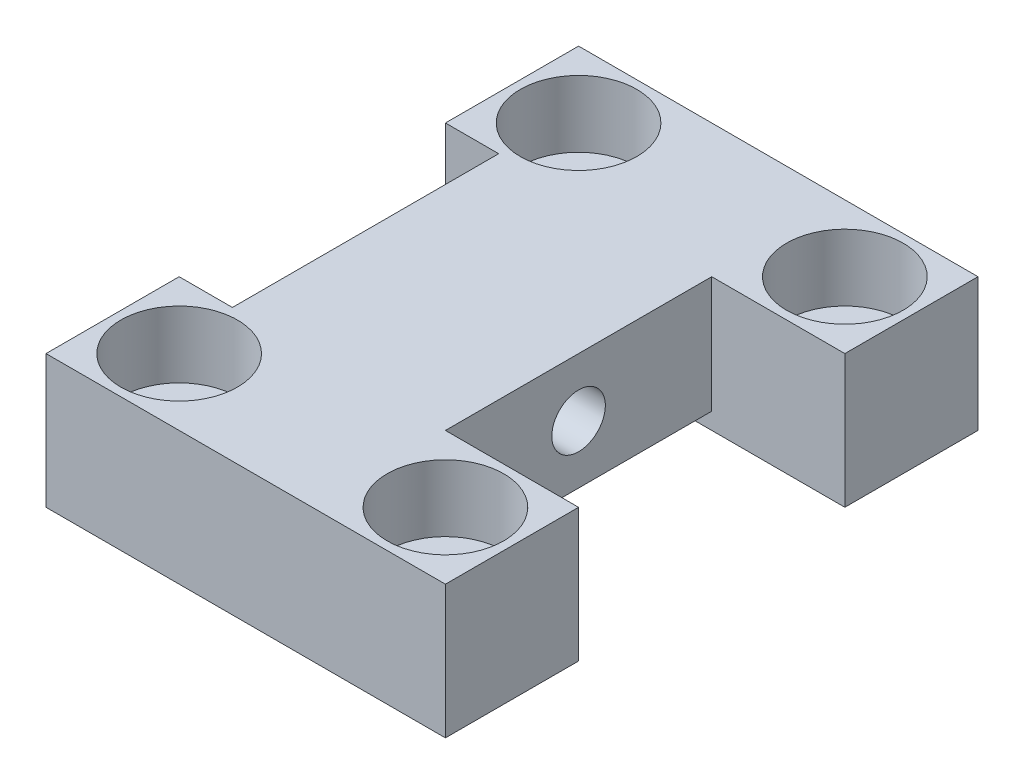
ISO-10303-21;
HEADER;
FILE_DESCRIPTION(('STEP AP214'),'2;1');
FILE_NAME('part.step','',(''),(''),'','','');
FILE_SCHEMA(('AUTOMOTIVE_DESIGN { 1 0 10303 214 1 1 1 1 }'));
ENDSEC;
DATA;
#1=APPLICATION_CONTEXT('core data for automotive mechanical design processes');
#2=APPLICATION_PROTOCOL_DEFINITION('international standard','automotive_design',2000,#1);
#3=PRODUCT_CONTEXT('',#1,'mechanical');
#4=PRODUCT('Part','Part','',(#3));
#5=PRODUCT_RELATED_PRODUCT_CATEGORY('part','',(#4));
#6=PRODUCT_DEFINITION_FORMATION('','',#4);
#7=PRODUCT_DEFINITION_CONTEXT('part definition',#1,'design');
#8=PRODUCT_DEFINITION('design','',#6,#7);
#9=PRODUCT_DEFINITION_SHAPE('','',#8);
#10=(LENGTH_UNIT() NAMED_UNIT(*) SI_UNIT(.MILLI.,.METRE.));
#11=(NAMED_UNIT(*) PLANE_ANGLE_UNIT() SI_UNIT($,.RADIAN.));
#12=(NAMED_UNIT(*) SI_UNIT($,.STERADIAN.) SOLID_ANGLE_UNIT());
#13=UNCERTAINTY_MEASURE_WITH_UNIT(LENGTH_MEASURE(1.E-05),#10,'distance_accuracy_value','');
#14=(GEOMETRIC_REPRESENTATION_CONTEXT(3) GLOBAL_UNCERTAINTY_ASSIGNED_CONTEXT((#13)) GLOBAL_UNIT_ASSIGNED_CONTEXT((#10,
#11,#12)) REPRESENTATION_CONTEXT('',''));
#15=CARTESIAN_POINT('',(0.,0.,0.));
#16=DIRECTION('',(0.,0.,1.));
#17=DIRECTION('',(1.,0.,0.));
#18=AXIS2_PLACEMENT_3D('',#15,#16,#17);
#19=CARTESIAN_POINT('',(-19.05,0.,25.4));
#20=DIRECTION('',(0.,1.,0.));
#21=DIRECTION('',(0.,0.,1.));
#22=AXIS2_PLACEMENT_3D('',#19,#20,#21);
#23=PLANE('',#22);
#24=CARTESIAN_POINT('',(-12.7,0.,19.05));
#25=DIRECTION('',(0.,1.,0.));
#26=DIRECTION('',(0.,0.,1.));
#27=AXIS2_PLACEMENT_3D('',#24,#25,#26);
#28=CIRCLE('',#27,3.3782);
#29=CARTESIAN_POINT('',(-12.7,0.,22.4282));
#30=VERTEX_POINT('',#29);
#31=EDGE_CURVE('E214',#30,#30,#28,.T.);
#32=ORIENTED_EDGE('',*,*,#31,.T.);
#33=EDGE_LOOP('',(#32));
#34=FACE_BOUND('',#33,.T.);
#35=CARTESIAN_POINT('',(12.7,0.,19.05));
#36=DIRECTION('',(0.,1.,0.));
#37=DIRECTION('',(0.,0.,1.));
#38=AXIS2_PLACEMENT_3D('',#35,#36,#37);
#39=CIRCLE('',#38,3.3782);
#40=CARTESIAN_POINT('',(12.7,0.,22.4282));
#41=VERTEX_POINT('',#40);
#42=EDGE_CURVE('E202',#41,#41,#39,.T.);
#43=ORIENTED_EDGE('',*,*,#42,.T.);
#44=EDGE_LOOP('',(#43));
#45=FACE_BOUND('',#44,.T.);
#46=DIRECTION('',(1.,0.,0.));
#47=VECTOR('',#46,1.);
#48=CARTESIAN_POINT('',(-19.05,0.,12.7));
#49=LINE('',#48,#47);
#50=CARTESIAN_POINT('',(-19.05,0.,12.7));
#51=VERTEX_POINT('',#50);
#52=CARTESIAN_POINT('',(19.05,0.,12.7));
#53=VERTEX_POINT('',#52);
#54=EDGE_CURVE('E250',#51,#53,#49,.T.);
#55=ORIENTED_EDGE('',*,*,#54,.T.);
#56=DIRECTION('',(0.,0.,-1.));
#57=VECTOR('',#56,1.);
#58=CARTESIAN_POINT('',(19.05,0.,-25.4));
#59=LINE('',#58,#57);
#60=CARTESIAN_POINT('',(19.05,0.,25.4));
#61=VERTEX_POINT('',#60);
#62=EDGE_CURVE('E233',#61,#53,#59,.T.);
#63=ORIENTED_EDGE('',*,*,#62,.F.);
#64=DIRECTION('',(1.,0.,0.));
#65=VECTOR('',#64,1.);
#66=CARTESIAN_POINT('',(-19.05,0.,25.4));
#67=LINE('',#66,#65);
#68=CARTESIAN_POINT('',(-19.05,0.,25.4));
#69=VERTEX_POINT('',#68);
#70=EDGE_CURVE('E231',#69,#61,#67,.T.);
#71=ORIENTED_EDGE('',*,*,#70,.F.);
#72=DIRECTION('',(0.,0.,1.));
#73=VECTOR('',#72,1.);
#74=CARTESIAN_POINT('',(-19.05,0.,-25.4));
#75=LINE('',#74,#73);
#76=EDGE_CURVE('E217',#51,#69,#75,.T.);
#77=ORIENTED_EDGE('',*,*,#76,.F.);
#78=EDGE_LOOP('',(#55,#63,#71,#77));
#79=FACE_BOUND('',#78,.T.);
#80=ADVANCED_FACE('F34',(#34,#45,#79),#23,.F.);
#81=CARTESIAN_POINT('',(-13.97,0.,-12.7));
#82=DIRECTION('',(1.,0.,0.));
#83=DIRECTION('',(0.,0.,-1.));
#84=AXIS2_PLACEMENT_3D('',#81,#82,#83);
#85=PLANE('',#84);
#86=CARTESIAN_POINT('',(-13.97,7.14375,0.));
#87=DIRECTION('',(-1.,0.,0.));
#88=DIRECTION('',(0.,0.,1.));
#89=AXIS2_PLACEMENT_3D('',#86,#87,#88);
#90=CIRCLE('',#89,2.55269999999999);
#91=CARTESIAN_POINT('',(-13.97,7.14375,2.55269999999999));
#92=VERTEX_POINT('',#91);
#93=EDGE_CURVE('E344',#92,#92,#90,.T.);
#94=ORIENTED_EDGE('',*,*,#93,.F.);
#95=EDGE_LOOP('',(#94));
#96=FACE_BOUND('',#95,.T.);
#97=DIRECTION('',(0.,0.,-1.));
#98=VECTOR('',#97,1.);
#99=CARTESIAN_POINT('',(-13.97,1.5875,12.7));
#100=LINE('',#99,#98);
#101=CARTESIAN_POINT('',(-13.97,1.5875,12.7));
#102=VERTEX_POINT('',#101);
#103=CARTESIAN_POINT('',(-13.97,1.5875,-12.7));
#104=VERTEX_POINT('',#103);
#105=EDGE_CURVE('E144',#102,#104,#100,.T.);
#106=ORIENTED_EDGE('',*,*,#105,.F.);
#107=DIRECTION('',(0.,1.,0.));
#108=VECTOR('',#107,1.);
#109=CARTESIAN_POINT('',(-13.97,0.,12.7));
#110=LINE('',#109,#108);
#111=CARTESIAN_POINT('',(-13.97,12.7,12.7));
#112=VERTEX_POINT('',#111);
#113=EDGE_CURVE('E159',#102,#112,#110,.T.);
#114=ORIENTED_EDGE('',*,*,#113,.T.);
#115=DIRECTION('',(0.,0.,-1.));
#116=VECTOR('',#115,1.);
#117=CARTESIAN_POINT('',(-13.97,12.7,-12.7));
#118=LINE('',#117,#116);
#119=CARTESIAN_POINT('',(-13.97,12.7,-12.7));
#120=VERTEX_POINT('',#119);
#121=EDGE_CURVE('E156',#112,#120,#118,.T.);
#122=ORIENTED_EDGE('',*,*,#121,.T.);
#123=DIRECTION('',(0.,1.,0.));
#124=VECTOR('',#123,1.);
#125=CARTESIAN_POINT('',(-13.97,0.,-12.7));
#126=LINE('',#125,#124);
#127=EDGE_CURVE('E137',#104,#120,#126,.T.);
#128=ORIENTED_EDGE('',*,*,#127,.F.);
#129=EDGE_LOOP('',(#106,#114,#122,#128));
#130=FACE_BOUND('',#129,.T.);
#131=ADVANCED_FACE('F154',(#96,#130),#85,.F.);
#132=CARTESIAN_POINT('',(6.35,0.,-12.7));
#133=DIRECTION('',(-1.,0.,0.));
#134=DIRECTION('',(0.,0.,1.));
#135=AXIS2_PLACEMENT_3D('',#132,#133,#134);
#136=PLANE('',#135);
#137=CARTESIAN_POINT('',(6.35,7.14375,0.));
#138=DIRECTION('',(-1.,0.,0.));
#139=DIRECTION('',(0.,0.,1.));
#140=AXIS2_PLACEMENT_3D('',#137,#138,#139);
#141=CIRCLE('',#140,2.55269999999999);
#142=CARTESIAN_POINT('',(6.35,7.14375,2.55269999999999));
#143=VERTEX_POINT('',#142);
#144=EDGE_CURVE('E152',#143,#143,#141,.T.);
#145=ORIENTED_EDGE('',*,*,#144,.T.);
#146=EDGE_LOOP('',(#145));
#147=FACE_BOUND('',#146,.T.);
#148=DIRECTION('',(0.,0.,1.));
#149=VECTOR('',#148,1.);
#150=CARTESIAN_POINT('',(6.35,1.5875,12.7));
#151=LINE('',#150,#149);
#152=CARTESIAN_POINT('',(6.35,1.5875,-12.7));
#153=VERTEX_POINT('',#152);
#154=CARTESIAN_POINT('',(6.35,1.5875,12.7));
#155=VERTEX_POINT('',#154);
#156=EDGE_CURVE('E143',#153,#155,#151,.T.);
#157=ORIENTED_EDGE('',*,*,#156,.F.);
#158=DIRECTION('',(0.,1.,0.));
#159=VECTOR('',#158,1.);
#160=CARTESIAN_POINT('',(6.35,0.,-12.7));
#161=LINE('',#160,#159);
#162=CARTESIAN_POINT('',(6.35,12.7,-12.7));
#163=VERTEX_POINT('',#162);
#164=EDGE_CURVE('E140',#153,#163,#161,.T.);
#165=ORIENTED_EDGE('',*,*,#164,.T.);
#166=DIRECTION('',(0.,0.,1.));
#167=VECTOR('',#166,1.);
#168=CARTESIAN_POINT('',(6.35,12.7,-12.7));
#169=LINE('',#168,#167);
#170=CARTESIAN_POINT('',(6.35,12.7,12.7));
#171=VERTEX_POINT('',#170);
#172=EDGE_CURVE('E337',#163,#171,#169,.T.);
#173=ORIENTED_EDGE('',*,*,#172,.T.);
#174=DIRECTION('',(0.,1.,0.));
#175=VECTOR('',#174,1.);
#176=CARTESIAN_POINT('',(6.35,0.,12.7));
#177=LINE('',#176,#175);
#178=EDGE_CURVE('E262',#155,#171,#177,.T.);
#179=ORIENTED_EDGE('',*,*,#178,.F.);
#180=EDGE_LOOP('',(#157,#165,#173,#179));
#181=FACE_BOUND('',#180,.T.);
#182=ADVANCED_FACE('F316',(#147,#181),#136,.F.);
#183=CARTESIAN_POINT('',(19.05,12.7,-25.4));
#184=DIRECTION('',(-1.,0.,0.));
#185=DIRECTION('',(0.,0.,1.));
#186=AXIS2_PLACEMENT_3D('',#183,#184,#185);
#187=PLANE('',#186);
#188=ORIENTED_EDGE('',*,*,#62,.T.);
#189=DIRECTION('',(0.,1.,0.));
#190=VECTOR('',#189,1.);
#191=CARTESIAN_POINT('',(19.05,0.,12.7));
#192=LINE('',#191,#190);
#193=CARTESIAN_POINT('',(19.05,12.7,12.7));
#194=VERTEX_POINT('',#193);
#195=EDGE_CURVE('E256',#53,#194,#192,.T.);
#196=ORIENTED_EDGE('',*,*,#195,.T.);
#197=DIRECTION('',(0.,0.,-1.));
#198=VECTOR('',#197,1.);
#199=CARTESIAN_POINT('',(19.05,12.7,-25.4));
#200=LINE('',#199,#198);
#201=CARTESIAN_POINT('',(19.05,12.7,25.4));
#202=VERTEX_POINT('',#201);
#203=EDGE_CURVE('E223',#202,#194,#200,.T.);
#204=ORIENTED_EDGE('',*,*,#203,.F.);
#205=DIRECTION('',(0.,-1.,0.));
#206=VECTOR('',#205,1.);
#207=CARTESIAN_POINT('',(19.05,12.7,25.4));
#208=LINE('',#207,#206);
#209=EDGE_CURVE('E43',#202,#61,#208,.T.);
#210=ORIENTED_EDGE('',*,*,#209,.T.);
#211=EDGE_LOOP('',(#188,#196,#204,#210));
#212=FACE_BOUND('',#211,.T.);
#213=ADVANCED_FACE('F244',(#212),#187,.F.);
#214=CARTESIAN_POINT('',(-19.05,12.7,-25.4));
#215=DIRECTION('',(1.,0.,0.));
#216=DIRECTION('',(0.,0.,-1.));
#217=AXIS2_PLACEMENT_3D('',#214,#215,#216);
#218=PLANE('',#217);
#219=CARTESIAN_POINT('',(-19.05,0.,-25.4));
#220=VERTEX_POINT('',#219);
#221=CARTESIAN_POINT('',(-19.05,0.,-12.7));
#222=VERTEX_POINT('',#221);
#223=EDGE_CURVE('E228',#220,#222,#75,.T.);
#224=ORIENTED_EDGE('',*,*,#223,.T.);
#225=DIRECTION('',(0.,1.,0.));
#226=VECTOR('',#225,1.);
#227=CARTESIAN_POINT('',(-19.05,0.,-12.7));
#228=LINE('',#227,#226);
#229=CARTESIAN_POINT('',(-19.05,12.7,-12.7));
#230=VERTEX_POINT('',#229);
#231=EDGE_CURVE('E158',#222,#230,#228,.T.);
#232=ORIENTED_EDGE('',*,*,#231,.T.);
#233=DIRECTION('',(0.,0.,1.));
#234=VECTOR('',#233,1.);
#235=CARTESIAN_POINT('',(-19.05,12.7,-25.4));
#236=LINE('',#235,#234);
#237=CARTESIAN_POINT('',(-19.05,12.7,-25.4));
#238=VERTEX_POINT('',#237);
#239=EDGE_CURVE('E218',#238,#230,#236,.T.);
#240=ORIENTED_EDGE('',*,*,#239,.F.);
#241=DIRECTION('',(0.,-1.,0.));
#242=VECTOR('',#241,1.);
#243=CARTESIAN_POINT('',(-19.05,12.7,-25.4));
#244=LINE('',#243,#242);
#245=EDGE_CURVE('E227',#238,#220,#244,.T.);
#246=ORIENTED_EDGE('',*,*,#245,.T.);
#247=EDGE_LOOP('',(#224,#232,#240,#246));
#248=FACE_BOUND('',#247,.T.);
#249=ADVANCED_FACE('F276',(#248),#218,.F.);
#250=CARTESIAN_POINT('',(-19.05,12.7,12.7));
#251=VERTEX_POINT('',#250);
#252=CARTESIAN_POINT('',(-19.05,12.7,25.4));
#253=VERTEX_POINT('',#252);
#254=EDGE_CURVE('E82',#251,#253,#236,.T.);
#255=ORIENTED_EDGE('',*,*,#254,.F.);
#256=DIRECTION('',(0.,1.,0.));
#257=VECTOR('',#256,1.);
#258=CARTESIAN_POINT('',(-19.05,0.,12.7));
#259=LINE('',#258,#257);
#260=EDGE_CURVE('E164',#51,#251,#259,.T.);
#261=ORIENTED_EDGE('',*,*,#260,.F.);
#262=ORIENTED_EDGE('',*,*,#76,.T.);
#263=DIRECTION('',(0.,-1.,0.));
#264=VECTOR('',#263,1.);
#265=CARTESIAN_POINT('',(-19.05,12.7,25.4));
#266=LINE('',#265,#264);
#267=EDGE_CURVE('E11',#253,#69,#266,.T.);
#268=ORIENTED_EDGE('',*,*,#267,.F.);
#269=EDGE_LOOP('',(#255,#261,#262,#268));
#270=FACE_BOUND('',#269,.T.);
#271=ADVANCED_FACE('F36',(#270),#218,.F.);
#272=CARTESIAN_POINT('',(-19.05,12.7,25.4));
#273=DIRECTION('',(0.,0.,-1.));
#274=DIRECTION('',(-1.,0.,0.));
#275=AXIS2_PLACEMENT_3D('',#272,#273,#274);
#276=PLANE('',#275);
#277=ORIENTED_EDGE('',*,*,#70,.T.);
#278=ORIENTED_EDGE('',*,*,#209,.F.);
#279=DIRECTION('',(1.,0.,0.));
#280=VECTOR('',#279,1.);
#281=CARTESIAN_POINT('',(-19.05,12.7,25.4));
#282=LINE('',#281,#280);
#283=EDGE_CURVE('E220',#253,#202,#282,.T.);
#284=ORIENTED_EDGE('',*,*,#283,.F.);
#285=ORIENTED_EDGE('',*,*,#267,.T.);
#286=EDGE_LOOP('',(#277,#278,#284,#285));
#287=FACE_BOUND('',#286,.T.);
#288=ADVANCED_FACE('F360',(#287),#276,.F.);
#289=CARTESIAN_POINT('',(19.05,12.7,-12.7));
#290=VERTEX_POINT('',#289);
#291=CARTESIAN_POINT('',(19.05,12.7,-25.4));
#292=VERTEX_POINT('',#291);
#293=EDGE_CURVE('E222',#290,#292,#200,.T.);
#294=ORIENTED_EDGE('',*,*,#293,.F.);
#295=DIRECTION('',(0.,1.,0.));
#296=VECTOR('',#295,1.);
#297=CARTESIAN_POINT('',(19.05,0.,-12.7));
#298=LINE('',#297,#296);
#299=CARTESIAN_POINT('',(19.05,0.,-12.7));
#300=VERTEX_POINT('',#299);
#301=EDGE_CURVE('E270',#300,#290,#298,.T.);
#302=ORIENTED_EDGE('',*,*,#301,.F.);
#303=CARTESIAN_POINT('',(19.05,0.,-25.4));
#304=VERTEX_POINT('',#303);
#305=EDGE_CURVE('E69',#300,#304,#59,.T.);
#306=ORIENTED_EDGE('',*,*,#305,.T.);
#307=DIRECTION('',(0.,-1.,0.));
#308=VECTOR('',#307,1.);
#309=CARTESIAN_POINT('',(19.05,12.7,-25.4));
#310=LINE('',#309,#308);
#311=EDGE_CURVE('E238',#292,#304,#310,.T.);
#312=ORIENTED_EDGE('',*,*,#311,.F.);
#313=EDGE_LOOP('',(#294,#302,#306,#312));
#314=FACE_BOUND('',#313,.T.);
#315=ADVANCED_FACE('F334',(#314),#187,.F.);
#316=CARTESIAN_POINT('',(-19.05,12.7,-25.4));
#317=DIRECTION('',(0.,0.,1.));
#318=DIRECTION('',(1.,0.,0.));
#319=AXIS2_PLACEMENT_3D('',#316,#317,#318);
#320=PLANE('',#319);
#321=DIRECTION('',(-1.,0.,0.));
#322=VECTOR('',#321,1.);
#323=CARTESIAN_POINT('',(-19.05,0.,-25.4));
#324=LINE('',#323,#322);
#325=EDGE_CURVE('E75',#304,#220,#324,.T.);
#326=ORIENTED_EDGE('',*,*,#325,.T.);
#327=ORIENTED_EDGE('',*,*,#245,.F.);
#328=DIRECTION('',(-1.,0.,0.));
#329=VECTOR('',#328,1.);
#330=CARTESIAN_POINT('',(-19.05,12.7,-25.4));
#331=LINE('',#330,#329);
#332=EDGE_CURVE('E51',#292,#238,#331,.T.);
#333=ORIENTED_EDGE('',*,*,#332,.F.);
#334=ORIENTED_EDGE('',*,*,#311,.T.);
#335=EDGE_LOOP('',(#326,#327,#333,#334));
#336=FACE_BOUND('',#335,.T.);
#337=ADVANCED_FACE('F283',(#336),#320,.F.);
#338=CARTESIAN_POINT('',(-19.05,12.7,25.4));
#339=DIRECTION('',(0.,1.,0.));
#340=DIRECTION('',(0.,0.,1.));
#341=AXIS2_PLACEMENT_3D('',#338,#339,#340);
#342=PLANE('',#341);
#343=DIRECTION('',(1.,0.,0.));
#344=VECTOR('',#343,1.);
#345=CARTESIAN_POINT('',(19.05,12.7,12.7));
#346=LINE('',#345,#344);
#347=EDGE_CURVE('E260',#171,#194,#346,.T.);
#348=ORIENTED_EDGE('',*,*,#347,.F.);
#349=ORIENTED_EDGE('',*,*,#172,.F.);
#350=DIRECTION('',(-1.,0.,0.));
#351=VECTOR('',#350,1.);
#352=CARTESIAN_POINT('',(19.05,12.7,-12.7));
#353=LINE('',#352,#351);
#354=EDGE_CURVE('E335',#290,#163,#353,.T.);
#355=ORIENTED_EDGE('',*,*,#354,.F.);
#356=ORIENTED_EDGE('',*,*,#293,.T.);
#357=ORIENTED_EDGE('',*,*,#332,.T.);
#358=ORIENTED_EDGE('',*,*,#239,.T.);
#359=DIRECTION('',(-1.,0.,0.));
#360=VECTOR('',#359,1.);
#361=CARTESIAN_POINT('',(-19.05,12.7,-12.7));
#362=LINE('',#361,#360);
#363=EDGE_CURVE('E254',#120,#230,#362,.T.);
#364=ORIENTED_EDGE('',*,*,#363,.F.);
#365=ORIENTED_EDGE('',*,*,#121,.F.);
#366=DIRECTION('',(1.,0.,0.));
#367=VECTOR('',#366,1.);
#368=CARTESIAN_POINT('',(-19.05,12.7,12.7));
#369=LINE('',#368,#367);
#370=EDGE_CURVE('E261',#251,#112,#369,.T.);
#371=ORIENTED_EDGE('',*,*,#370,.F.);
#372=ORIENTED_EDGE('',*,*,#254,.T.);
#373=ORIENTED_EDGE('',*,*,#283,.T.);
#374=ORIENTED_EDGE('',*,*,#203,.T.);
#375=EDGE_LOOP('',(#348,#349,#355,#356,#357,#358,#364,#365,#371,#372,#373,#374));
#376=FACE_BOUND('',#375,.T.);
#377=CARTESIAN_POINT('',(-12.7,12.7,-19.05));
#378=DIRECTION('',(0.,1.,0.));
#379=DIRECTION('',(0.,0.,1.));
#380=AXIS2_PLACEMENT_3D('',#377,#378,#379);
#381=CIRCLE('',#380,5.55625);
#382=CARTESIAN_POINT('',(-12.7,12.7,-13.49375));
#383=VERTEX_POINT('',#382);
#384=EDGE_CURVE('E162',#383,#383,#381,.T.);
#385=ORIENTED_EDGE('',*,*,#384,.F.);
#386=EDGE_LOOP('',(#385));
#387=FACE_BOUND('',#386,.T.);
#388=CARTESIAN_POINT('',(12.7,12.7,-19.05));
#389=DIRECTION('',(0.,1.,0.));
#390=DIRECTION('',(0.,0.,1.));
#391=AXIS2_PLACEMENT_3D('',#388,#389,#390);
#392=CIRCLE('',#391,5.55625);
#393=CARTESIAN_POINT('',(12.7,12.7,-13.49375));
#394=VERTEX_POINT('',#393);
#395=EDGE_CURVE('E181',#394,#394,#392,.T.);
#396=ORIENTED_EDGE('',*,*,#395,.F.);
#397=EDGE_LOOP('',(#396));
#398=FACE_BOUND('',#397,.T.);
#399=CARTESIAN_POINT('',(12.7,12.7,19.05));
#400=DIRECTION('',(0.,1.,0.));
#401=DIRECTION('',(0.,0.,1.));
#402=AXIS2_PLACEMENT_3D('',#399,#400,#401);
#403=CIRCLE('',#402,5.55625);
#404=CARTESIAN_POINT('',(12.7,12.7,24.60625));
#405=VERTEX_POINT('',#404);
#406=EDGE_CURVE('E193',#405,#405,#403,.T.);
#407=ORIENTED_EDGE('',*,*,#406,.F.);
#408=EDGE_LOOP('',(#407));
#409=FACE_BOUND('',#408,.T.);
#410=CARTESIAN_POINT('',(-12.7,12.7,19.05));
#411=DIRECTION('',(0.,1.,0.));
#412=DIRECTION('',(0.,0.,1.));
#413=AXIS2_PLACEMENT_3D('',#410,#411,#412);
#414=CIRCLE('',#413,5.55625);
#415=CARTESIAN_POINT('',(-12.7,12.7,24.60625));
#416=VERTEX_POINT('',#415);
#417=EDGE_CURVE('E205',#416,#416,#414,.T.);
#418=ORIENTED_EDGE('',*,*,#417,.F.);
#419=EDGE_LOOP('',(#418));
#420=FACE_BOUND('',#419,.T.);
#421=ADVANCED_FACE('F278',(#376,#387,#398,#409,#420),#342,.T.);
#422=CARTESIAN_POINT('',(-12.7,0.,-19.05));
#423=DIRECTION('',(0.,1.,0.));
#424=DIRECTION('',(0.,0.,1.));
#425=AXIS2_PLACEMENT_3D('',#422,#423,#424);
#426=CIRCLE('',#425,3.3782);
#427=CARTESIAN_POINT('',(-12.7,0.,-15.6718));
#428=VERTEX_POINT('',#427);
#429=EDGE_CURVE('E178',#428,#428,#426,.T.);
#430=ORIENTED_EDGE('',*,*,#429,.T.);
#431=EDGE_LOOP('',(#430));
#432=FACE_BOUND('',#431,.T.);
#433=CARTESIAN_POINT('',(12.7,0.,-19.05));
#434=DIRECTION('',(0.,1.,0.));
#435=DIRECTION('',(0.,0.,1.));
#436=AXIS2_PLACEMENT_3D('',#433,#434,#435);
#437=CIRCLE('',#436,3.3782);
#438=CARTESIAN_POINT('',(12.7,0.,-15.6718));
#439=VERTEX_POINT('',#438);
#440=EDGE_CURVE('E190',#439,#439,#437,.T.);
#441=ORIENTED_EDGE('',*,*,#440,.T.);
#442=EDGE_LOOP('',(#441));
#443=FACE_BOUND('',#442,.T.);
#444=ORIENTED_EDGE('',*,*,#305,.F.);
#445=DIRECTION('',(-1.,0.,0.));
#446=VECTOR('',#445,1.);
#447=CARTESIAN_POINT('',(-19.05,0.,-12.7));
#448=LINE('',#447,#446);
#449=EDGE_CURVE('E169',#300,#222,#448,.T.);
#450=ORIENTED_EDGE('',*,*,#449,.T.);
#451=ORIENTED_EDGE('',*,*,#223,.F.);
#452=ORIENTED_EDGE('',*,*,#325,.F.);
#453=EDGE_LOOP('',(#444,#450,#451,#452));
#454=FACE_BOUND('',#453,.T.);
#455=ADVANCED_FACE('F282',(#432,#443,#454),#23,.F.);
#456=CARTESIAN_POINT('',(-12.7,12.7,19.05));
#457=DIRECTION('',(0.,1.,0.));
#458=DIRECTION('',(0.,0.,1.));
#459=AXIS2_PLACEMENT_3D('',#456,#457,#458);
#460=CYLINDRICAL_SURFACE('',#459,3.3782);
#461=ORIENTED_EDGE('',*,*,#31,.F.);
#462=EDGE_LOOP('',(#461));
#463=FACE_BOUND('',#462,.T.);
#464=CARTESIAN_POINT('',(-12.7,6.35,19.05));
#465=DIRECTION('',(0.,1.,0.));
#466=DIRECTION('',(0.,0.,1.));
#467=AXIS2_PLACEMENT_3D('',#464,#465,#466);
#468=CIRCLE('',#467,3.3782);
#469=CARTESIAN_POINT('',(-12.7,6.35,22.4282));
#470=VERTEX_POINT('',#469);
#471=EDGE_CURVE('E211',#470,#470,#468,.T.);
#472=ORIENTED_EDGE('',*,*,#471,.T.);
#473=EDGE_LOOP('',(#472));
#474=FACE_BOUND('',#473,.T.);
#475=ADVANCED_FACE('F306',(#463,#474),#460,.F.);
#476=CARTESIAN_POINT('',(-9.3218,6.35,19.05));
#477=DIRECTION('',(0.,-1.,0.));
#478=DIRECTION('',(0.,0.,-1.));
#479=AXIS2_PLACEMENT_3D('',#476,#477,#478);
#480=PLANE('',#479);
#481=ORIENTED_EDGE('',*,*,#471,.F.);
#482=EDGE_LOOP('',(#481));
#483=FACE_BOUND('',#482,.T.);
#484=CARTESIAN_POINT('',(-12.7,6.35,19.05));
#485=DIRECTION('',(0.,1.,0.));
#486=DIRECTION('',(0.,0.,1.));
#487=AXIS2_PLACEMENT_3D('',#484,#485,#486);
#488=CIRCLE('',#487,5.55625);
#489=CARTESIAN_POINT('',(-12.7,6.35,24.60625));
#490=VERTEX_POINT('',#489);
#491=EDGE_CURVE('E208',#490,#490,#488,.T.);
#492=ORIENTED_EDGE('',*,*,#491,.T.);
#493=EDGE_LOOP('',(#492));
#494=FACE_BOUND('',#493,.T.);
#495=ADVANCED_FACE('F296',(#483,#494),#480,.F.);
#496=CARTESIAN_POINT('',(-12.7,12.7,19.05));
#497=DIRECTION('',(0.,1.,0.));
#498=DIRECTION('',(0.,0.,1.));
#499=AXIS2_PLACEMENT_3D('',#496,#497,#498);
#500=CYLINDRICAL_SURFACE('',#499,5.55625);
#501=ORIENTED_EDGE('',*,*,#491,.F.);
#502=EDGE_LOOP('',(#501));
#503=FACE_BOUND('',#502,.T.);
#504=ORIENTED_EDGE('',*,*,#417,.T.);
#505=EDGE_LOOP('',(#504));
#506=FACE_BOUND('',#505,.T.);
#507=ADVANCED_FACE('F293',(#503,#506),#500,.F.);
#508=CARTESIAN_POINT('',(12.7,12.7,19.05));
#509=DIRECTION('',(0.,1.,0.));
#510=DIRECTION('',(0.,0.,1.));
#511=AXIS2_PLACEMENT_3D('',#508,#509,#510);
#512=CYLINDRICAL_SURFACE('',#511,3.3782);
#513=ORIENTED_EDGE('',*,*,#42,.F.);
#514=EDGE_LOOP('',(#513));
#515=FACE_BOUND('',#514,.T.);
#516=CARTESIAN_POINT('',(12.7,6.35,19.05));
#517=DIRECTION('',(0.,1.,0.));
#518=DIRECTION('',(0.,0.,1.));
#519=AXIS2_PLACEMENT_3D('',#516,#517,#518);
#520=CIRCLE('',#519,3.3782);
#521=CARTESIAN_POINT('',(12.7,6.35,22.4282));
#522=VERTEX_POINT('',#521);
#523=EDGE_CURVE('E199',#522,#522,#520,.T.);
#524=ORIENTED_EDGE('',*,*,#523,.T.);
#525=EDGE_LOOP('',(#524));
#526=FACE_BOUND('',#525,.T.);
#527=ADVANCED_FACE('F295',(#515,#526),#512,.F.);
#528=CARTESIAN_POINT('',(16.0782,6.35,19.05));
#529=DIRECTION('',(0.,-1.,0.));
#530=DIRECTION('',(0.,0.,-1.));
#531=AXIS2_PLACEMENT_3D('',#528,#529,#530);
#532=PLANE('',#531);
#533=ORIENTED_EDGE('',*,*,#523,.F.);
#534=EDGE_LOOP('',(#533));
#535=FACE_BOUND('',#534,.T.);
#536=CARTESIAN_POINT('',(12.7,6.35,19.05));
#537=DIRECTION('',(0.,1.,0.));
#538=DIRECTION('',(0.,0.,1.));
#539=AXIS2_PLACEMENT_3D('',#536,#537,#538);
#540=CIRCLE('',#539,5.55625);
#541=CARTESIAN_POINT('',(12.7,6.35,24.60625));
#542=VERTEX_POINT('',#541);
#543=EDGE_CURVE('E196',#542,#542,#540,.T.);
#544=ORIENTED_EDGE('',*,*,#543,.T.);
#545=EDGE_LOOP('',(#544));
#546=FACE_BOUND('',#545,.T.);
#547=ADVANCED_FACE('F303',(#535,#546),#532,.F.);
#548=CARTESIAN_POINT('',(12.7,12.7,19.05));
#549=DIRECTION('',(0.,1.,0.));
#550=DIRECTION('',(0.,0.,1.));
#551=AXIS2_PLACEMENT_3D('',#548,#549,#550);
#552=CYLINDRICAL_SURFACE('',#551,5.55625);
#553=ORIENTED_EDGE('',*,*,#543,.F.);
#554=EDGE_LOOP('',(#553));
#555=FACE_BOUND('',#554,.T.);
#556=ORIENTED_EDGE('',*,*,#406,.T.);
#557=EDGE_LOOP('',(#556));
#558=FACE_BOUND('',#557,.T.);
#559=ADVANCED_FACE('F528',(#555,#558),#552,.F.);
#560=CARTESIAN_POINT('',(12.7,12.7,-19.05));
#561=DIRECTION('',(0.,1.,0.));
#562=DIRECTION('',(0.,0.,1.));
#563=AXIS2_PLACEMENT_3D('',#560,#561,#562);
#564=CYLINDRICAL_SURFACE('',#563,3.3782);
#565=ORIENTED_EDGE('',*,*,#440,.F.);
#566=EDGE_LOOP('',(#565));
#567=FACE_BOUND('',#566,.T.);
#568=CARTESIAN_POINT('',(12.7,6.35,-19.05));
#569=DIRECTION('',(0.,1.,0.));
#570=DIRECTION('',(0.,0.,1.));
#571=AXIS2_PLACEMENT_3D('',#568,#569,#570);
#572=CIRCLE('',#571,3.3782);
#573=CARTESIAN_POINT('',(12.7,6.35,-15.6718));
#574=VERTEX_POINT('',#573);
#575=EDGE_CURVE('E187',#574,#574,#572,.T.);
#576=ORIENTED_EDGE('',*,*,#575,.T.);
#577=EDGE_LOOP('',(#576));
#578=FACE_BOUND('',#577,.T.);
#579=ADVANCED_FACE('F519',(#567,#578),#564,.F.);
#580=CARTESIAN_POINT('',(16.0782,6.35,-19.05));
#581=DIRECTION('',(0.,-1.,0.));
#582=DIRECTION('',(0.,0.,-1.));
#583=AXIS2_PLACEMENT_3D('',#580,#581,#582);
#584=PLANE('',#583);
#585=ORIENTED_EDGE('',*,*,#575,.F.);
#586=EDGE_LOOP('',(#585));
#587=FACE_BOUND('',#586,.T.);
#588=CARTESIAN_POINT('',(12.7,6.35,-19.05));
#589=DIRECTION('',(0.,1.,0.));
#590=DIRECTION('',(0.,0.,1.));
#591=AXIS2_PLACEMENT_3D('',#588,#589,#590);
#592=CIRCLE('',#591,5.55625);
#593=CARTESIAN_POINT('',(12.7,6.35,-13.49375));
#594=VERTEX_POINT('',#593);
#595=EDGE_CURVE('E184',#594,#594,#592,.T.);
#596=ORIENTED_EDGE('',*,*,#595,.T.);
#597=EDGE_LOOP('',(#596));
#598=FACE_BOUND('',#597,.T.);
#599=ADVANCED_FACE('F510',(#587,#598),#584,.F.);
#600=CARTESIAN_POINT('',(12.7,12.7,-19.05));
#601=DIRECTION('',(0.,1.,0.));
#602=DIRECTION('',(0.,0.,1.));
#603=AXIS2_PLACEMENT_3D('',#600,#601,#602);
#604=CYLINDRICAL_SURFACE('',#603,5.55625);
#605=ORIENTED_EDGE('',*,*,#595,.F.);
#606=EDGE_LOOP('',(#605));
#607=FACE_BOUND('',#606,.T.);
#608=ORIENTED_EDGE('',*,*,#395,.T.);
#609=EDGE_LOOP('',(#608));
#610=FACE_BOUND('',#609,.T.);
#611=ADVANCED_FACE('F501',(#607,#610),#604,.F.);
#612=CARTESIAN_POINT('',(-12.7,12.7,-19.05));
#613=DIRECTION('',(0.,1.,0.));
#614=DIRECTION('',(0.,0.,1.));
#615=AXIS2_PLACEMENT_3D('',#612,#613,#614);
#616=CYLINDRICAL_SURFACE('',#615,3.3782);
#617=ORIENTED_EDGE('',*,*,#429,.F.);
#618=EDGE_LOOP('',(#617));
#619=FACE_BOUND('',#618,.T.);
#620=CARTESIAN_POINT('',(-12.7,6.35,-19.05));
#621=DIRECTION('',(0.,1.,0.));
#622=DIRECTION('',(0.,0.,1.));
#623=AXIS2_PLACEMENT_3D('',#620,#621,#622);
#624=CIRCLE('',#623,3.3782);
#625=CARTESIAN_POINT('',(-12.7,6.35,-15.6718));
#626=VERTEX_POINT('',#625);
#627=EDGE_CURVE('E175',#626,#626,#624,.T.);
#628=ORIENTED_EDGE('',*,*,#627,.T.);
#629=EDGE_LOOP('',(#628));
#630=FACE_BOUND('',#629,.T.);
#631=ADVANCED_FACE('F492',(#619,#630),#616,.F.);
#632=CARTESIAN_POINT('',(-9.3218,6.35,-19.05));
#633=DIRECTION('',(0.,-1.,0.));
#634=DIRECTION('',(0.,0.,-1.));
#635=AXIS2_PLACEMENT_3D('',#632,#633,#634);
#636=PLANE('',#635);
#637=ORIENTED_EDGE('',*,*,#627,.F.);
#638=EDGE_LOOP('',(#637));
#639=FACE_BOUND('',#638,.T.);
#640=CARTESIAN_POINT('',(-12.7,6.35,-19.05));
#641=DIRECTION('',(0.,1.,0.));
#642=DIRECTION('',(0.,0.,1.));
#643=AXIS2_PLACEMENT_3D('',#640,#641,#642);
#644=CIRCLE('',#643,5.55625);
#645=CARTESIAN_POINT('',(-12.7,6.35,-13.49375));
#646=VERTEX_POINT('',#645);
#647=EDGE_CURVE('E172',#646,#646,#644,.T.);
#648=ORIENTED_EDGE('',*,*,#647,.T.);
#649=EDGE_LOOP('',(#648));
#650=FACE_BOUND('',#649,.T.);
#651=ADVANCED_FACE('F483',(#639,#650),#636,.F.);
#652=CARTESIAN_POINT('',(-12.7,12.7,-19.05));
#653=DIRECTION('',(0.,1.,0.));
#654=DIRECTION('',(0.,0.,1.));
#655=AXIS2_PLACEMENT_3D('',#652,#653,#654);
#656=CYLINDRICAL_SURFACE('',#655,5.55625);
#657=ORIENTED_EDGE('',*,*,#647,.F.);
#658=EDGE_LOOP('',(#657));
#659=FACE_BOUND('',#658,.T.);
#660=ORIENTED_EDGE('',*,*,#384,.T.);
#661=EDGE_LOOP('',(#660));
#662=FACE_BOUND('',#661,.T.);
#663=ADVANCED_FACE('F400',(#659,#662),#656,.F.);
#664=CARTESIAN_POINT('',(-19.05,0.,-12.7));
#665=DIRECTION('',(0.,0.,-1.));
#666=DIRECTION('',(-1.,0.,0.));
#667=AXIS2_PLACEMENT_3D('',#664,#665,#666);
#668=PLANE('',#667);
#669=ORIENTED_EDGE('',*,*,#363,.T.);
#670=ORIENTED_EDGE('',*,*,#231,.F.);
#671=ORIENTED_EDGE('',*,*,#449,.F.);
#672=ORIENTED_EDGE('',*,*,#301,.T.);
#673=ORIENTED_EDGE('',*,*,#354,.T.);
#674=ORIENTED_EDGE('',*,*,#164,.F.);
#675=DIRECTION('',(1.,0.,0.));
#676=VECTOR('',#675,1.);
#677=CARTESIAN_POINT('',(-13.97,1.5875,-12.7));
#678=LINE('',#677,#676);
#679=EDGE_CURVE('E133',#104,#153,#678,.T.);
#680=ORIENTED_EDGE('',*,*,#679,.F.);
#681=ORIENTED_EDGE('',*,*,#127,.T.);
#682=EDGE_LOOP('',(#669,#670,#671,#672,#673,#674,#680,#681));
#683=FACE_BOUND('',#682,.T.);
#684=ADVANCED_FACE('F135',(#683),#668,.F.);
#685=CARTESIAN_POINT('',(-19.05,0.,12.7));
#686=DIRECTION('',(0.,0.,1.));
#687=DIRECTION('',(1.,0.,0.));
#688=AXIS2_PLACEMENT_3D('',#685,#686,#687);
#689=PLANE('',#688);
#690=ORIENTED_EDGE('',*,*,#370,.T.);
#691=ORIENTED_EDGE('',*,*,#113,.F.);
#692=DIRECTION('',(-1.,0.,0.));
#693=VECTOR('',#692,1.);
#694=CARTESIAN_POINT('',(-13.97,1.5875,12.7));
#695=LINE('',#694,#693);
#696=EDGE_CURVE('E149',#155,#102,#695,.T.);
#697=ORIENTED_EDGE('',*,*,#696,.F.);
#698=ORIENTED_EDGE('',*,*,#178,.T.);
#699=ORIENTED_EDGE('',*,*,#347,.T.);
#700=ORIENTED_EDGE('',*,*,#195,.F.);
#701=ORIENTED_EDGE('',*,*,#54,.F.);
#702=ORIENTED_EDGE('',*,*,#260,.T.);
#703=EDGE_LOOP('',(#690,#691,#697,#698,#699,#700,#701,#702));
#704=FACE_BOUND('',#703,.T.);
#705=ADVANCED_FACE('F258',(#704),#689,.F.);
#706=CARTESIAN_POINT('',(-13.97,1.5875,-12.7));
#707=DIRECTION('',(0.,-1.,0.));
#708=DIRECTION('',(0.,0.,-1.));
#709=AXIS2_PLACEMENT_3D('',#706,#707,#708);
#710=PLANE('',#709);
#711=ORIENTED_EDGE('',*,*,#105,.T.);
#712=ORIENTED_EDGE('',*,*,#679,.T.);
#713=ORIENTED_EDGE('',*,*,#156,.T.);
#714=ORIENTED_EDGE('',*,*,#696,.T.);
#715=EDGE_LOOP('',(#711,#712,#713,#714));
#716=FACE_BOUND('',#715,.T.);
#717=ADVANCED_FACE('F147',(#716),#710,.T.);
#718=CARTESIAN_POINT('',(-13.97,7.14375,0.));
#719=DIRECTION('',(-1.,0.,0.));
#720=DIRECTION('',(0.,0.,1.));
#721=AXIS2_PLACEMENT_3D('',#718,#719,#720);
#722=CYLINDRICAL_SURFACE('',#721,2.55269999999999);
#723=ORIENTED_EDGE('',*,*,#93,.T.);
#724=EDGE_LOOP('',(#723));
#725=FACE_BOUND('',#724,.T.);
#726=ORIENTED_EDGE('',*,*,#144,.F.);
#727=EDGE_LOOP('',(#726));
#728=FACE_BOUND('',#727,.T.);
#729=ADVANCED_FACE('F348',(#725,#728),#722,.F.);
#730=CLOSED_SHELL('',(#80,#131,#182,#213,#249,#271,#288,#315,#337,#421,#455,#475,#495,#507,#527,
#547,#559,#579,#599,#611,#631,#651,#663,#684,#705,#717,#729));
#731=MANIFOLD_SOLID_BREP('B2',#730);
#732=ADVANCED_BREP_SHAPE_REPRESENTATION('',(#18,#731),#14);
#733=SHAPE_DEFINITION_REPRESENTATION(#9,#732);
ENDSEC;
END-ISO-10303-21;
